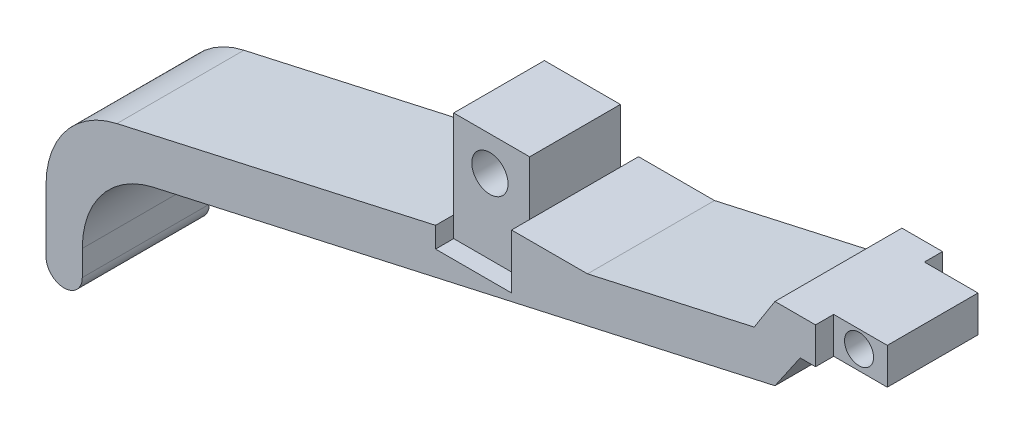
ISO-10303-21;
HEADER;
FILE_DESCRIPTION(('STEP AP214'),'2;1');
FILE_NAME('part.step','',(''),(''),'','','');
FILE_SCHEMA(('AUTOMOTIVE_DESIGN { 1 0 10303 214 1 1 1 1 }'));
ENDSEC;
DATA;
#1=APPLICATION_CONTEXT('core data for automotive mechanical design processes');
#2=APPLICATION_PROTOCOL_DEFINITION('international standard','automotive_design',2000,#1);
#3=PRODUCT_CONTEXT('',#1,'mechanical');
#4=PRODUCT('Part','Part','',(#3));
#5=PRODUCT_RELATED_PRODUCT_CATEGORY('part','',(#4));
#6=PRODUCT_DEFINITION_FORMATION('','',#4);
#7=PRODUCT_DEFINITION_CONTEXT('part definition',#1,'design');
#8=PRODUCT_DEFINITION('design','',#6,#7);
#9=PRODUCT_DEFINITION_SHAPE('','',#8);
#10=(LENGTH_UNIT() NAMED_UNIT(*) SI_UNIT(.MILLI.,.METRE.));
#11=(NAMED_UNIT(*) PLANE_ANGLE_UNIT() SI_UNIT($,.RADIAN.));
#12=(NAMED_UNIT(*) SI_UNIT($,.STERADIAN.) SOLID_ANGLE_UNIT());
#13=UNCERTAINTY_MEASURE_WITH_UNIT(LENGTH_MEASURE(1.E-05),#10,'distance_accuracy_value','');
#14=(GEOMETRIC_REPRESENTATION_CONTEXT(3) GLOBAL_UNCERTAINTY_ASSIGNED_CONTEXT((#13)) GLOBAL_UNIT_ASSIGNED_CONTEXT((#10,
#11,#12)) REPRESENTATION_CONTEXT('',''));
#15=CARTESIAN_POINT('',(0.,0.,0.));
#16=DIRECTION('',(0.,0.,1.));
#17=DIRECTION('',(1.,0.,0.));
#18=AXIS2_PLACEMENT_3D('',#15,#16,#17);
#19=CARTESIAN_POINT('',(-31.9744682141532,4.39963354942464,7.));
#20=DIRECTION('',(0.218023084150926,-0.975943612498857,0.));
#21=DIRECTION('',(0.975943612498857,0.218023084150926,0.));
#22=AXIS2_PLACEMENT_3D('',#19,#20,#21);
#23=PLANE('',#22);
#24=DIRECTION('',(-0.975943612498857,-0.218023084150926,0.));
#25=VECTOR('',#24,1.);
#26=CARTESIAN_POINT('',(-31.9744682141532,4.39963354942464,7.));
#27=LINE('',#26,#25);
#28=CARTESIAN_POINT('',(-14.4105382537988,8.32336657121519,7.));
#29=VERTEX_POINT('',#28);
#30=CARTESIAN_POINT('',(-31.9744682141532,4.39963354942464,7.));
#31=VERTEX_POINT('',#30);
#32=EDGE_CURVE('E356',#29,#31,#27,.T.);
#33=ORIENTED_EDGE('',*,*,#32,.F.);
#34=DIRECTION('',(0.,0.,-1.));
#35=VECTOR('',#34,1.);
#36=CARTESIAN_POINT('',(-14.4105382537988,8.32336657121519,7.));
#37=LINE('',#36,#35);
#38=CARTESIAN_POINT('',(-14.4105382537988,8.32336657121519,6.));
#39=VERTEX_POINT('',#38);
#40=EDGE_CURVE('E277',#29,#39,#37,.T.);
#41=ORIENTED_EDGE('',*,*,#40,.T.);
#42=DIRECTION('',(0.,0.,1.));
#43=VECTOR('',#42,1.);
#44=CARTESIAN_POINT('',(-14.4105382537988,8.32336657121519,0.));
#45=LINE('',#44,#43);
#46=CARTESIAN_POINT('',(-14.4105382537988,8.32336657121519,1.));
#47=VERTEX_POINT('',#46);
#48=EDGE_CURVE('E324',#47,#39,#45,.T.);
#49=ORIENTED_EDGE('',*,*,#48,.F.);
#50=CARTESIAN_POINT('',(-14.4105382537988,8.32336657121519,0.));
#51=VERTEX_POINT('',#50);
#52=EDGE_CURVE('E321',#51,#47,#45,.T.);
#53=ORIENTED_EDGE('',*,*,#52,.F.);
#54=DIRECTION('',(-0.975943612498857,-0.218023084150926,0.));
#55=VECTOR('',#54,1.);
#56=CARTESIAN_POINT('',(-31.9744682141532,4.39963354942464,0.));
#57=LINE('',#56,#55);
#58=CARTESIAN_POINT('',(-31.9744682141532,4.39963354942464,0.));
#59=VERTEX_POINT('',#58);
#60=EDGE_CURVE('E381',#51,#59,#57,.T.);
#61=ORIENTED_EDGE('',*,*,#60,.T.);
#62=DIRECTION('',(0.,0.,-1.));
#63=VECTOR('',#62,1.);
#64=CARTESIAN_POINT('',(-31.9744682141532,4.39963354942464,7.));
#65=LINE('',#64,#63);
#66=EDGE_CURVE('E392',#31,#59,#65,.T.);
#67=ORIENTED_EDGE('',*,*,#66,.F.);
#68=EDGE_LOOP('',(#33,#41,#49,#53,#61,#67));
#69=FACE_BOUND('',#68,.T.);
#70=ADVANCED_FACE('F37',(#69),#23,.F.);
#71=CARTESIAN_POINT('',(-34.8843527933986,-3.90947195366568,7.));
#72=DIRECTION('',(0.,0.,-1.));
#73=DIRECTION('',(-1.,0.,0.));
#74=AXIS2_PLACEMENT_3D('',#71,#72,#73);
#75=CYLINDRICAL_SURFACE('',#74,0.999999999999997);
#76=CARTESIAN_POINT('',(-34.8843527933986,-3.90947195366568,0.));
#77=DIRECTION('',(0.,0.,1.));
#78=DIRECTION('',(-1.,0.,0.));
#79=AXIS2_PLACEMENT_3D('',#76,#77,#78);
#80=CIRCLE('',#79,0.999999999999997);
#81=CARTESIAN_POINT('',(-35.8843527933986,-3.90947195366568,0.));
#82=VERTEX_POINT('',#81);
#83=CARTESIAN_POINT('',(-33.8843527933986,-3.90947195366568,0.));
#84=VERTEX_POINT('',#83);
#85=EDGE_CURVE('E323',#82,#84,#80,.T.);
#86=ORIENTED_EDGE('',*,*,#85,.T.);
#87=DIRECTION('',(0.,0.,-1.));
#88=VECTOR('',#87,1.);
#89=CARTESIAN_POINT('',(-33.8843527933986,-3.90947195366568,7.));
#90=LINE('',#89,#88);
#91=CARTESIAN_POINT('',(-33.8843527933986,-3.90947195366568,7.));
#92=VERTEX_POINT('',#91);
#93=EDGE_CURVE('E12',#92,#84,#90,.T.);
#94=ORIENTED_EDGE('',*,*,#93,.F.);
#95=CARTESIAN_POINT('',(-34.8843527933986,-3.90947195366568,7.));
#96=DIRECTION('',(0.,0.,1.));
#97=DIRECTION('',(-1.,0.,0.));
#98=AXIS2_PLACEMENT_3D('',#95,#96,#97);
#99=CIRCLE('',#98,0.999999999999997);
#100=CARTESIAN_POINT('',(-35.8843527933986,-3.90947195366568,7.));
#101=VERTEX_POINT('',#100);
#102=EDGE_CURVE('E337',#101,#92,#99,.T.);
#103=ORIENTED_EDGE('',*,*,#102,.F.);
#104=DIRECTION('',(0.,0.,-1.));
#105=VECTOR('',#104,1.);
#106=CARTESIAN_POINT('',(-35.8843527933986,-3.90947195366568,7.));
#107=LINE('',#106,#105);
#108=EDGE_CURVE('E363',#101,#82,#107,.T.);
#109=ORIENTED_EDGE('',*,*,#108,.T.);
#110=EDGE_LOOP('',(#86,#94,#103,#109));
#111=FACE_BOUND('',#110,.T.);
#112=ADVANCED_FACE('F39',(#111),#75,.T.);
#113=CARTESIAN_POINT('',(-33.8843527933986,-2.51823698971936,7.));
#114=DIRECTION('',(-1.,0.,0.));
#115=DIRECTION('',(0.,-1.,0.));
#116=AXIS2_PLACEMENT_3D('',#113,#114,#115);
#117=PLANE('',#116);
#118=DIRECTION('',(0.,1.,0.));
#119=VECTOR('',#118,1.);
#120=CARTESIAN_POINT('',(-33.8843527933986,-2.51823698971936,0.));
#121=LINE('',#120,#119);
#122=CARTESIAN_POINT('',(-33.8843527933986,-2.51823698971936,0.));
#123=VERTEX_POINT('',#122);
#124=EDGE_CURVE('E366',#84,#123,#121,.T.);
#125=ORIENTED_EDGE('',*,*,#124,.T.);
#126=DIRECTION('',(0.,0.,-1.));
#127=VECTOR('',#126,1.);
#128=CARTESIAN_POINT('',(-33.8843527933986,-2.51823698971936,7.));
#129=LINE('',#128,#127);
#130=CARTESIAN_POINT('',(-33.8843527933986,-2.51823698971936,7.));
#131=VERTEX_POINT('',#130);
#132=EDGE_CURVE('E46',#131,#123,#129,.T.);
#133=ORIENTED_EDGE('',*,*,#132,.F.);
#134=DIRECTION('',(0.,1.,0.));
#135=VECTOR('',#134,1.);
#136=CARTESIAN_POINT('',(-33.8843527933986,-2.51823698971936,7.));
#137=LINE('',#136,#135);
#138=EDGE_CURVE('E340',#92,#131,#137,.T.);
#139=ORIENTED_EDGE('',*,*,#138,.F.);
#140=ORIENTED_EDGE('',*,*,#93,.T.);
#141=EDGE_LOOP('',(#125,#133,#139,#140));
#142=FACE_BOUND('',#141,.T.);
#143=ADVANCED_FACE('F490',(#142),#117,.F.);
#144=CARTESIAN_POINT('',(-28.8843527933986,-2.51823698971936,7.));
#145=DIRECTION('',(0.,0.,-1.));
#146=DIRECTION('',(-1.,0.,0.));
#147=AXIS2_PLACEMENT_3D('',#144,#145,#146);
#148=CYLINDRICAL_SURFACE('',#147,5.);
#149=CARTESIAN_POINT('',(-28.8843527933986,-2.51823698971936,0.));
#150=DIRECTION('',(0.,0.,-1.));
#151=DIRECTION('',(1.,0.,0.));
#152=AXIS2_PLACEMENT_3D('',#149,#150,#151);
#153=CIRCLE('',#152,5.);
#154=CARTESIAN_POINT('',(-29.9744682141532,2.36148107277493,0.));
#155=VERTEX_POINT('',#154);
#156=EDGE_CURVE('E368',#123,#155,#153,.T.);
#157=ORIENTED_EDGE('',*,*,#156,.T.);
#158=DIRECTION('',(0.,0.,-1.));
#159=VECTOR('',#158,1.);
#160=CARTESIAN_POINT('',(-29.9744682141532,2.36148107277493,7.));
#161=LINE('',#160,#159);
#162=CARTESIAN_POINT('',(-29.9744682141532,2.36148107277493,7.));
#163=VERTEX_POINT('',#162);
#164=EDGE_CURVE('E413',#163,#155,#161,.T.);
#165=ORIENTED_EDGE('',*,*,#164,.F.);
#166=CARTESIAN_POINT('',(-28.8843527933986,-2.51823698971936,7.));
#167=DIRECTION('',(0.,0.,-1.));
#168=DIRECTION('',(1.,0.,0.));
#169=AXIS2_PLACEMENT_3D('',#166,#167,#168);
#170=CIRCLE('',#169,5.);
#171=EDGE_CURVE('E343',#131,#163,#170,.T.);
#172=ORIENTED_EDGE('',*,*,#171,.F.);
#173=ORIENTED_EDGE('',*,*,#132,.T.);
#174=EDGE_LOOP('',(#157,#165,#172,#173));
#175=FACE_BOUND('',#174,.T.);
#176=ADVANCED_FACE('F493',(#175),#148,.F.);
#177=CARTESIAN_POINT('',(4.29646039935999,10.0175110496534,7.));
#178=DIRECTION('',(-0.218023084150926,0.975943612498857,0.));
#179=DIRECTION('',(-0.975943612498857,-0.218023084150926,0.));
#180=AXIS2_PLACEMENT_3D('',#177,#178,#179);
#181=PLANE('',#180);
#182=DIRECTION('',(0.975943612498857,0.218023084150926,0.));
#183=VECTOR('',#182,1.);
#184=CARTESIAN_POINT('',(4.29646039935999,10.0175110496534,0.));
#185=LINE('',#184,#183);
#186=CARTESIAN_POINT('',(4.29646039935999,10.0175110496534,0.));
#187=VERTEX_POINT('',#186);
#188=EDGE_CURVE('E370',#155,#187,#185,.T.);
#189=ORIENTED_EDGE('',*,*,#188,.T.);
#190=DIRECTION('',(0.,0.,-1.));
#191=VECTOR('',#190,1.);
#192=CARTESIAN_POINT('',(4.29646039935999,10.0175110496534,7.));
#193=LINE('',#192,#191);
#194=CARTESIAN_POINT('',(4.29646039935999,10.0175110496534,7.));
#195=VERTEX_POINT('',#194);
#196=EDGE_CURVE('E410',#195,#187,#193,.T.);
#197=ORIENTED_EDGE('',*,*,#196,.F.);
#198=DIRECTION('',(0.975943612498857,0.218023084150926,0.));
#199=VECTOR('',#198,1.);
#200=CARTESIAN_POINT('',(4.29646039935999,10.0175110496534,7.));
#201=LINE('',#200,#199);
#202=EDGE_CURVE('E345',#163,#195,#201,.T.);
#203=ORIENTED_EDGE('',*,*,#202,.F.);
#204=ORIENTED_EDGE('',*,*,#164,.T.);
#205=EDGE_LOOP('',(#189,#197,#203,#204));
#206=FACE_BOUND('',#205,.T.);
#207=ADVANCED_FACE('F498',(#206),#181,.F.);
#208=CARTESIAN_POINT('',(4.29646039935999,10.0175110496534,7.));
#209=DIRECTION('',(-0.824410867479304,0.565991803458337,0.));
#210=DIRECTION('',(-0.565991803458337,-0.824410867479304,0.));
#211=AXIS2_PLACEMENT_3D('',#208,#209,#210);
#212=PLANE('',#211);
#213=DIRECTION('',(0.565991803458337,0.824410867479304,0.));
#214=VECTOR('',#213,1.);
#215=CARTESIAN_POINT('',(4.29646039935999,10.0175110496534,0.));
#216=LINE('',#215,#214);
#217=CARTESIAN_POINT('',(5.68728202772147,12.043350395984,0.));
#218=VERTEX_POINT('',#217);
#219=EDGE_CURVE('E372',#187,#218,#216,.T.);
#220=ORIENTED_EDGE('',*,*,#219,.T.);
#221=DIRECTION('',(0.,0.,-1.));
#222=VECTOR('',#221,1.);
#223=CARTESIAN_POINT('',(5.68728202772147,12.043350395984,7.));
#224=LINE('',#223,#222);
#225=CARTESIAN_POINT('',(5.68728202772147,12.043350395984,7.));
#226=VERTEX_POINT('',#225);
#227=EDGE_CURVE('E407',#226,#218,#224,.T.);
#228=ORIENTED_EDGE('',*,*,#227,.F.);
#229=DIRECTION('',(0.565991803458337,0.824410867479304,0.));
#230=VECTOR('',#229,1.);
#231=CARTESIAN_POINT('',(4.29646039935999,10.0175110496534,7.));
#232=LINE('',#231,#230);
#233=EDGE_CURVE('E347',#195,#226,#232,.T.);
#234=ORIENTED_EDGE('',*,*,#233,.F.);
#235=ORIENTED_EDGE('',*,*,#196,.T.);
#236=EDGE_LOOP('',(#220,#228,#234,#235));
#237=FACE_BOUND('',#236,.T.);
#238=ADVANCED_FACE('F503',(#237),#212,.F.);
#239=CARTESIAN_POINT('',(9.48938033351357,12.043350395984,7.));
#240=DIRECTION('',(0.,1.,0.));
#241=DIRECTION('',(0.,0.,1.));
#242=AXIS2_PLACEMENT_3D('',#239,#240,#241);
#243=PLANE('',#242);
#244=DIRECTION('',(0.,0.,-1.));
#245=VECTOR('',#244,1.);
#246=CARTESIAN_POINT('',(9.48938033351357,12.043350395984,7.));
#247=LINE('',#246,#245);
#248=CARTESIAN_POINT('',(9.48938033351357,12.043350395984,6.));
#249=VERTEX_POINT('',#248);
#250=CARTESIAN_POINT('',(9.48938033351357,12.043350395984,1.));
#251=VERTEX_POINT('',#250);
#252=EDGE_CURVE('E404',#249,#251,#247,.T.);
#253=ORIENTED_EDGE('',*,*,#252,.F.);
#254=DIRECTION('',(1.,0.,0.));
#255=VECTOR('',#254,1.);
#256=CARTESIAN_POINT('',(6.53439533204678,12.043350395984,6.));
#257=LINE('',#256,#255);
#258=CARTESIAN_POINT('',(6.53439533204678,12.043350395984,6.));
#259=VERTEX_POINT('',#258);
#260=EDGE_CURVE('E284',#259,#249,#257,.T.);
#261=ORIENTED_EDGE('',*,*,#260,.F.);
#262=DIRECTION('',(0.,0.,-1.));
#263=VECTOR('',#262,1.);
#264=CARTESIAN_POINT('',(6.53439533204678,12.043350395984,7.));
#265=LINE('',#264,#263);
#266=CARTESIAN_POINT('',(6.53439533204678,12.043350395984,7.));
#267=VERTEX_POINT('',#266);
#268=EDGE_CURVE('E281',#267,#259,#265,.T.);
#269=ORIENTED_EDGE('',*,*,#268,.F.);
#270=DIRECTION('',(1.,0.,0.));
#271=VECTOR('',#270,1.);
#272=CARTESIAN_POINT('',(9.48938033351357,12.043350395984,7.));
#273=LINE('',#272,#271);
#274=EDGE_CURVE('E349',#226,#267,#273,.T.);
#275=ORIENTED_EDGE('',*,*,#274,.F.);
#276=ORIENTED_EDGE('',*,*,#227,.T.);
#277=DIRECTION('',(1.,0.,0.));
#278=VECTOR('',#277,1.);
#279=CARTESIAN_POINT('',(9.48938033351357,12.043350395984,0.));
#280=LINE('',#279,#278);
#281=CARTESIAN_POINT('',(6.53439533204678,12.043350395984,0.));
#282=VERTEX_POINT('',#281);
#283=EDGE_CURVE('E374',#218,#282,#280,.T.);
#284=ORIENTED_EDGE('',*,*,#283,.T.);
#285=DIRECTION('',(0.,0.,-1.));
#286=VECTOR('',#285,1.);
#287=CARTESIAN_POINT('',(6.53439533204678,12.043350395984,0.));
#288=LINE('',#287,#286);
#289=CARTESIAN_POINT('',(6.53439533204678,12.043350395984,1.));
#290=VERTEX_POINT('',#289);
#291=EDGE_CURVE('E297',#290,#282,#288,.T.);
#292=ORIENTED_EDGE('',*,*,#291,.F.);
#293=DIRECTION('',(-1.,0.,0.));
#294=VECTOR('',#293,1.);
#295=CARTESIAN_POINT('',(6.53439533204678,12.043350395984,1.));
#296=LINE('',#295,#294);
#297=EDGE_CURVE('E285',#251,#290,#296,.T.);
#298=ORIENTED_EDGE('',*,*,#297,.F.);
#299=EDGE_LOOP('',(#253,#261,#269,#275,#276,#284,#292,#298));
#300=FACE_BOUND('',#299,.T.);
#301=ADVANCED_FACE('F509',(#300),#243,.F.);
#302=CARTESIAN_POINT('',(9.48938033351357,14.043350395984,7.));
#303=DIRECTION('',(-1.,0.,0.));
#304=DIRECTION('',(0.,0.,1.));
#305=AXIS2_PLACEMENT_3D('',#302,#303,#304);
#306=PLANE('',#305);
#307=DIRECTION('',(0.,0.,-1.));
#308=VECTOR('',#307,1.);
#309=CARTESIAN_POINT('',(9.48938033351357,14.043350395984,7.));
#310=LINE('',#309,#308);
#311=CARTESIAN_POINT('',(9.48938033351357,14.043350395984,6.));
#312=VERTEX_POINT('',#311);
#313=CARTESIAN_POINT('',(9.48938033351357,14.043350395984,1.));
#314=VERTEX_POINT('',#313);
#315=EDGE_CURVE('E401',#312,#314,#310,.T.);
#316=ORIENTED_EDGE('',*,*,#315,.F.);
#317=DIRECTION('',(0.,-1.,0.));
#318=VECTOR('',#317,1.);
#319=CARTESIAN_POINT('',(9.48938033351357,22.0433503959839,6.));
#320=LINE('',#319,#318);
#321=EDGE_CURVE('E288',#312,#249,#320,.T.);
#322=ORIENTED_EDGE('',*,*,#321,.T.);
#323=ORIENTED_EDGE('',*,*,#252,.T.);
#324=DIRECTION('',(0.,-1.,0.));
#325=VECTOR('',#324,1.);
#326=CARTESIAN_POINT('',(9.48938033351357,22.0433503959839,1.));
#327=LINE('',#326,#325);
#328=EDGE_CURVE('E295',#314,#251,#327,.T.);
#329=ORIENTED_EDGE('',*,*,#328,.F.);
#330=EDGE_LOOP('',(#316,#322,#323,#329));
#331=FACE_BOUND('',#330,.T.);
#332=ADVANCED_FACE('F567',(#331),#306,.F.);
#333=CARTESIAN_POINT('',(4.29646039936,14.043350395984,7.));
#334=DIRECTION('',(0.,-1.,0.));
#335=DIRECTION('',(1.,0.,0.));
#336=AXIS2_PLACEMENT_3D('',#333,#334,#335);
#337=PLANE('',#336);
#338=DIRECTION('',(0.,0.,-1.));
#339=VECTOR('',#338,1.);
#340=CARTESIAN_POINT('',(6.53439533204678,14.043350395984,7.));
#341=LINE('',#340,#339);
#342=CARTESIAN_POINT('',(6.53439533204678,14.043350395984,7.));
#343=VERTEX_POINT('',#342);
#344=CARTESIAN_POINT('',(6.53439533204678,14.043350395984,6.));
#345=VERTEX_POINT('',#344);
#346=EDGE_CURVE('E62',#343,#345,#341,.T.);
#347=ORIENTED_EDGE('',*,*,#346,.T.);
#348=DIRECTION('',(1.,0.,0.));
#349=VECTOR('',#348,1.);
#350=CARTESIAN_POINT('',(4.29646039936,14.043350395984,6.));
#351=LINE('',#350,#349);
#352=EDGE_CURVE('E309',#345,#312,#351,.T.);
#353=ORIENTED_EDGE('',*,*,#352,.T.);
#354=ORIENTED_EDGE('',*,*,#315,.T.);
#355=DIRECTION('',(-1.,0.,0.));
#356=VECTOR('',#355,1.);
#357=CARTESIAN_POINT('',(4.29646039936,14.043350395984,1.));
#358=LINE('',#357,#356);
#359=CARTESIAN_POINT('',(6.53439533204678,14.043350395984,1.));
#360=VERTEX_POINT('',#359);
#361=EDGE_CURVE('E305',#314,#360,#358,.T.);
#362=ORIENTED_EDGE('',*,*,#361,.T.);
#363=DIRECTION('',(0.,0.,-1.));
#364=VECTOR('',#363,1.);
#365=CARTESIAN_POINT('',(6.53439533204678,14.043350395984,7.));
#366=LINE('',#365,#364);
#367=CARTESIAN_POINT('',(6.53439533204678,14.043350395984,0.));
#368=VERTEX_POINT('',#367);
#369=EDGE_CURVE('E312',#360,#368,#366,.T.);
#370=ORIENTED_EDGE('',*,*,#369,.T.);
#371=DIRECTION('',(-1.,0.,0.));
#372=VECTOR('',#371,1.);
#373=CARTESIAN_POINT('',(4.29646039936,14.043350395984,0.));
#374=LINE('',#373,#372);
#375=CARTESIAN_POINT('',(4.29646039936,14.043350395984,0.));
#376=VERTEX_POINT('',#375);
#377=EDGE_CURVE('E377',#368,#376,#374,.T.);
#378=ORIENTED_EDGE('',*,*,#377,.T.);
#379=DIRECTION('',(0.,0.,-1.));
#380=VECTOR('',#379,1.);
#381=CARTESIAN_POINT('',(4.29646039936,14.043350395984,7.));
#382=LINE('',#381,#380);
#383=CARTESIAN_POINT('',(4.29646039936,14.043350395984,7.));
#384=VERTEX_POINT('',#383);
#385=EDGE_CURVE('E398',#384,#376,#382,.T.);
#386=ORIENTED_EDGE('',*,*,#385,.F.);
#387=DIRECTION('',(-1.,0.,0.));
#388=VECTOR('',#387,1.);
#389=CARTESIAN_POINT('',(4.29646039936,14.043350395984,7.));
#390=LINE('',#389,#388);
#391=EDGE_CURVE('E352',#343,#384,#390,.T.);
#392=ORIENTED_EDGE('',*,*,#391,.F.);
#393=EDGE_LOOP('',(#347,#353,#354,#362,#370,#378,#386,#392));
#394=FACE_BOUND('',#393,.T.);
#395=ADVANCED_FACE('F515',(#394),#337,.F.);
#396=CARTESIAN_POINT('',(3.15339170655568,12.2470995930057,7.));
#397=DIRECTION('',(0.843661487732109,-0.536875492193157,0.));
#398=DIRECTION('',(0.536875492193158,0.843661487732109,0.));
#399=AXIS2_PLACEMENT_3D('',#396,#397,#398);
#400=PLANE('',#399);
#401=DIRECTION('',(-0.536875492193157,-0.843661487732109,0.));
#402=VECTOR('',#401,1.);
#403=CARTESIAN_POINT('',(3.15339170655568,12.2470995930057,0.));
#404=LINE('',#403,#402);
#405=CARTESIAN_POINT('',(3.15339170655568,12.2470995930057,0.));
#406=VERTEX_POINT('',#405);
#407=EDGE_CURVE('E379',#376,#406,#404,.T.);
#408=ORIENTED_EDGE('',*,*,#407,.T.);
#409=DIRECTION('',(0.,0.,-1.));
#410=VECTOR('',#409,1.);
#411=CARTESIAN_POINT('',(3.15339170655568,12.2470995930057,7.));
#412=LINE('',#411,#410);
#413=CARTESIAN_POINT('',(3.15339170655568,12.2470995930057,7.));
#414=VERTEX_POINT('',#413);
#415=EDGE_CURVE('E395',#414,#406,#412,.T.);
#416=ORIENTED_EDGE('',*,*,#415,.F.);
#417=DIRECTION('',(-0.536875492193157,-0.843661487732109,0.));
#418=VECTOR('',#417,1.);
#419=CARTESIAN_POINT('',(3.15339170655568,12.2470995930057,7.));
#420=LINE('',#419,#418);
#421=EDGE_CURVE('E354',#384,#414,#420,.T.);
#422=ORIENTED_EDGE('',*,*,#421,.F.);
#423=ORIENTED_EDGE('',*,*,#385,.T.);
#424=EDGE_LOOP('',(#408,#416,#422,#423));
#425=FACE_BOUND('',#424,.T.);
#426=ADVANCED_FACE('F521',(#425),#400,.F.);
#427=CARTESIAN_POINT('',(-6.034764609183,10.1944910693545,0.));
#428=VERTEX_POINT('',#427);
#429=EDGE_CURVE('E382',#406,#428,#57,.T.);
#430=ORIENTED_EDGE('',*,*,#429,.T.);
#431=DIRECTION('',(0.,0.,1.));
#432=VECTOR('',#431,1.);
#433=CARTESIAN_POINT('',(-6.034764609183,10.1944910693545,0.));
#434=LINE('',#433,#432);
#435=CARTESIAN_POINT('',(-6.034764609183,10.1944910693545,7.));
#436=VERTEX_POINT('',#435);
#437=EDGE_CURVE('E319',#428,#436,#434,.T.);
#438=ORIENTED_EDGE('',*,*,#437,.T.);
#439=EDGE_CURVE('E357',#414,#436,#27,.T.);
#440=ORIENTED_EDGE('',*,*,#439,.F.);
#441=ORIENTED_EDGE('',*,*,#415,.T.);
#442=EDGE_LOOP('',(#430,#438,#440,#441));
#443=FACE_BOUND('',#442,.T.);
#444=ADVANCED_FACE('F545',(#443),#23,.F.);
#445=CARTESIAN_POINT('',(-30.8843527933986,-0.480084513069647,7.));
#446=DIRECTION('',(0.,0.,-1.));
#447=DIRECTION('',(-1.,0.,0.));
#448=AXIS2_PLACEMENT_3D('',#445,#446,#447);
#449=CYLINDRICAL_SURFACE('',#448,5.);
#450=CARTESIAN_POINT('',(-30.8843527933986,-0.480084513069647,0.));
#451=DIRECTION('',(0.,0.,1.));
#452=DIRECTION('',(-1.,0.,0.));
#453=AXIS2_PLACEMENT_3D('',#450,#451,#452);
#454=CIRCLE('',#453,5.);
#455=CARTESIAN_POINT('',(-35.8843527933986,-0.480084513069669,0.));
#456=VERTEX_POINT('',#455);
#457=EDGE_CURVE('E384',#59,#456,#454,.T.);
#458=ORIENTED_EDGE('',*,*,#457,.T.);
#459=DIRECTION('',(0.,0.,-1.));
#460=VECTOR('',#459,1.);
#461=CARTESIAN_POINT('',(-35.8843527933986,-0.480084513069669,7.));
#462=LINE('',#461,#460);
#463=CARTESIAN_POINT('',(-35.8843527933986,-0.480084513069669,7.));
#464=VERTEX_POINT('',#463);
#465=EDGE_CURVE('E389',#464,#456,#462,.T.);
#466=ORIENTED_EDGE('',*,*,#465,.F.);
#467=CARTESIAN_POINT('',(-30.8843527933986,-0.480084513069647,7.));
#468=DIRECTION('',(0.,0.,1.));
#469=DIRECTION('',(-1.,0.,0.));
#470=AXIS2_PLACEMENT_3D('',#467,#468,#469);
#471=CIRCLE('',#470,5.);
#472=EDGE_CURVE('E359',#31,#464,#471,.T.);
#473=ORIENTED_EDGE('',*,*,#472,.F.);
#474=ORIENTED_EDGE('',*,*,#66,.T.);
#475=EDGE_LOOP('',(#458,#466,#473,#474));
#476=FACE_BOUND('',#475,.T.);
#477=ADVANCED_FACE('F474',(#476),#449,.T.);
#478=CARTESIAN_POINT('',(-35.8843527933986,-3.90947195366568,7.));
#479=DIRECTION('',(1.,0.,0.));
#480=DIRECTION('',(0.,1.,0.));
#481=AXIS2_PLACEMENT_3D('',#478,#479,#480);
#482=PLANE('',#481);
#483=DIRECTION('',(0.,-1.,0.));
#484=VECTOR('',#483,1.);
#485=CARTESIAN_POINT('',(-35.8843527933986,-3.90947195366568,0.));
#486=LINE('',#485,#484);
#487=EDGE_CURVE('E341',#456,#82,#486,.T.);
#488=ORIENTED_EDGE('',*,*,#487,.T.);
#489=ORIENTED_EDGE('',*,*,#108,.F.);
#490=DIRECTION('',(0.,-1.,0.));
#491=VECTOR('',#490,1.);
#492=CARTESIAN_POINT('',(-35.8843527933986,-3.90947195366568,7.));
#493=LINE('',#492,#491);
#494=EDGE_CURVE('E361',#464,#101,#493,.T.);
#495=ORIENTED_EDGE('',*,*,#494,.F.);
#496=ORIENTED_EDGE('',*,*,#465,.T.);
#497=EDGE_LOOP('',(#488,#489,#495,#496));
#498=FACE_BOUND('',#497,.T.);
#499=ADVANCED_FACE('F481',(#498),#482,.F.);
#500=CARTESIAN_POINT('',(-34.8843527933986,-3.90947195366568,7.));
#501=DIRECTION('',(0.,0.,-1.));
#502=DIRECTION('',(-1.,0.,0.));
#503=AXIS2_PLACEMENT_3D('',#500,#501,#502);
#504=PLANE('',#503);
#505=DIRECTION('',(1.,0.,0.));
#506=VECTOR('',#505,1.);
#507=CARTESIAN_POINT('',(-10.2226514314909,7.18832129988442,7.));
#508=LINE('',#507,#506);
#509=CARTESIAN_POINT('',(-14.4105382537988,7.18832129988442,7.));
#510=VERTEX_POINT('',#509);
#511=CARTESIAN_POINT('',(-10.2226514314909,7.18832129988442,7.));
#512=VERTEX_POINT('',#511);
#513=EDGE_CURVE('E230',#510,#512,#508,.T.);
#514=ORIENTED_EDGE('',*,*,#513,.F.);
#515=DIRECTION('',(0.,1.,0.));
#516=VECTOR('',#515,1.);
#517=CARTESIAN_POINT('',(-14.4105382537988,7.18832129988442,7.));
#518=LINE('',#517,#516);
#519=EDGE_CURVE('E423',#510,#29,#518,.T.);
#520=ORIENTED_EDGE('',*,*,#519,.T.);
#521=ORIENTED_EDGE('',*,*,#32,.T.);
#522=ORIENTED_EDGE('',*,*,#472,.T.);
#523=ORIENTED_EDGE('',*,*,#494,.T.);
#524=ORIENTED_EDGE('',*,*,#102,.T.);
#525=ORIENTED_EDGE('',*,*,#138,.T.);
#526=ORIENTED_EDGE('',*,*,#171,.T.);
#527=ORIENTED_EDGE('',*,*,#202,.T.);
#528=ORIENTED_EDGE('',*,*,#233,.T.);
#529=ORIENTED_EDGE('',*,*,#274,.T.);
#530=DIRECTION('',(0.,-1.,0.));
#531=VECTOR('',#530,1.);
#532=CARTESIAN_POINT('',(6.53439533204678,22.0433503959839,7.));
#533=LINE('',#532,#531);
#534=EDGE_CURVE('E287',#343,#267,#533,.T.);
#535=ORIENTED_EDGE('',*,*,#534,.F.);
#536=ORIENTED_EDGE('',*,*,#391,.T.);
#537=ORIENTED_EDGE('',*,*,#421,.T.);
#538=ORIENTED_EDGE('',*,*,#439,.T.);
#539=DIRECTION('',(-1.,0.,0.));
#540=VECTOR('',#539,1.);
#541=CARTESIAN_POINT('',(-6.034764609183,10.1944910693545,7.));
#542=LINE('',#541,#540);
#543=CARTESIAN_POINT('',(-10.2226514314909,10.1944910693545,7.));
#544=VERTEX_POINT('',#543);
#545=EDGE_CURVE('E245',#436,#544,#542,.T.);
#546=ORIENTED_EDGE('',*,*,#545,.T.);
#547=DIRECTION('',(0.,1.,0.));
#548=VECTOR('',#547,1.);
#549=CARTESIAN_POINT('',(-10.2226514314909,7.18832129988442,7.));
#550=LINE('',#549,#548);
#551=EDGE_CURVE('E222',#512,#544,#550,.T.);
#552=ORIENTED_EDGE('',*,*,#551,.F.);
#553=EDGE_LOOP('',(#514,#520,#521,#522,#523,#524,#525,#526,#527,#528,#529,#535,#536,#537,#538,
#546,#552));
#554=FACE_BOUND('',#553,.T.);
#555=ADVANCED_FACE('F242',(#554),#504,.F.);
#556=CARTESIAN_POINT('',(-34.8843527933986,-3.90947195366568,0.));
#557=DIRECTION('',(0.,0.,-1.));
#558=DIRECTION('',(-1.,0.,0.));
#559=AXIS2_PLACEMENT_3D('',#556,#557,#558);
#560=PLANE('',#559);
#561=DIRECTION('',(0.,1.,0.));
#562=VECTOR('',#561,1.);
#563=CARTESIAN_POINT('',(-10.2226514314909,7.18832129988442,0.));
#564=LINE('',#563,#562);
#565=CARTESIAN_POINT('',(-10.2226514314909,7.18832129988442,0.));
#566=VERTEX_POINT('',#565);
#567=CARTESIAN_POINT('',(-10.2226514314909,10.1944910693545,0.));
#568=VERTEX_POINT('',#567);
#569=EDGE_CURVE('E252',#566,#568,#564,.T.);
#570=ORIENTED_EDGE('',*,*,#569,.T.);
#571=DIRECTION('',(-1.,0.,0.));
#572=VECTOR('',#571,1.);
#573=CARTESIAN_POINT('',(-6.034764609183,10.1944910693545,0.));
#574=LINE('',#573,#572);
#575=EDGE_CURVE('E316',#428,#568,#574,.T.);
#576=ORIENTED_EDGE('',*,*,#575,.F.);
#577=ORIENTED_EDGE('',*,*,#429,.F.);
#578=ORIENTED_EDGE('',*,*,#407,.F.);
#579=ORIENTED_EDGE('',*,*,#377,.F.);
#580=DIRECTION('',(0.,-1.,0.));
#581=VECTOR('',#580,1.);
#582=CARTESIAN_POINT('',(6.53439533204678,22.0433503959839,0.));
#583=LINE('',#582,#581);
#584=EDGE_CURVE('E280',#368,#282,#583,.T.);
#585=ORIENTED_EDGE('',*,*,#584,.T.);
#586=ORIENTED_EDGE('',*,*,#283,.F.);
#587=ORIENTED_EDGE('',*,*,#219,.F.);
#588=ORIENTED_EDGE('',*,*,#188,.F.);
#589=ORIENTED_EDGE('',*,*,#156,.F.);
#590=ORIENTED_EDGE('',*,*,#124,.F.);
#591=ORIENTED_EDGE('',*,*,#85,.F.);
#592=ORIENTED_EDGE('',*,*,#487,.F.);
#593=ORIENTED_EDGE('',*,*,#457,.F.);
#594=ORIENTED_EDGE('',*,*,#60,.F.);
#595=DIRECTION('',(0.,1.,0.));
#596=VECTOR('',#595,1.);
#597=CARTESIAN_POINT('',(-14.4105382537988,7.18832129988442,0.));
#598=LINE('',#597,#596);
#599=CARTESIAN_POINT('',(-14.4105382537988,7.18832129988442,0.));
#600=VERTEX_POINT('',#599);
#601=EDGE_CURVE('E256',#600,#51,#598,.T.);
#602=ORIENTED_EDGE('',*,*,#601,.F.);
#603=DIRECTION('',(-1.,0.,0.));
#604=VECTOR('',#603,1.);
#605=CARTESIAN_POINT('',(-10.2226514314909,7.18832129988442,0.));
#606=LINE('',#605,#604);
#607=EDGE_CURVE('E272',#566,#600,#606,.T.);
#608=ORIENTED_EDGE('',*,*,#607,.F.);
#609=EDGE_LOOP('',(#570,#576,#577,#578,#579,#585,#586,#587,#588,#589,#590,#591,#592,#593,#594,
#602,#608));
#610=FACE_BOUND('',#609,.T.);
#611=ADVANCED_FACE('F477',(#610),#560,.T.);
#612=CARTESIAN_POINT('',(-14.4105382537988,10.1944910693545,0.));
#613=DIRECTION('',(-1.,0.,0.));
#614=DIRECTION('',(0.,0.,1.));
#615=AXIS2_PLACEMENT_3D('',#612,#613,#614);
#616=PLANE('',#615);
#617=DIRECTION('',(0.,1.,0.));
#618=VECTOR('',#617,1.);
#619=CARTESIAN_POINT('',(-14.4105382537988,7.18832129988442,6.));
#620=LINE('',#619,#618);
#621=CARTESIAN_POINT('',(-14.4105382537988,13.1883212998844,6.));
#622=VERTEX_POINT('',#621);
#623=EDGE_CURVE('E431',#39,#622,#620,.T.);
#624=ORIENTED_EDGE('',*,*,#623,.T.);
#625=DIRECTION('',(0.,0.,1.));
#626=VECTOR('',#625,1.);
#627=CARTESIAN_POINT('',(-14.4105382537988,13.1883212998844,0.));
#628=LINE('',#627,#626);
#629=CARTESIAN_POINT('',(-14.4105382537988,13.1883212998844,1.));
#630=VERTEX_POINT('',#629);
#631=EDGE_CURVE('E325',#630,#622,#628,.T.);
#632=ORIENTED_EDGE('',*,*,#631,.F.);
#633=DIRECTION('',(0.,1.,0.));
#634=VECTOR('',#633,1.);
#635=CARTESIAN_POINT('',(-14.4105382537988,7.18832129988442,1.));
#636=LINE('',#635,#634);
#637=EDGE_CURVE('E261',#47,#630,#636,.T.);
#638=ORIENTED_EDGE('',*,*,#637,.F.);
#639=ORIENTED_EDGE('',*,*,#48,.T.);
#640=EDGE_LOOP('',(#624,#632,#638,#639));
#641=FACE_BOUND('',#640,.T.);
#642=ADVANCED_FACE('F445',(#641),#616,.T.);
#643=CARTESIAN_POINT('',(-10.2226514314909,13.1883212998844,0.));
#644=DIRECTION('',(0.,1.,0.));
#645=DIRECTION('',(0.,0.,1.));
#646=AXIS2_PLACEMENT_3D('',#643,#644,#645);
#647=PLANE('',#646);
#648=DIRECTION('',(-1.,0.,0.));
#649=VECTOR('',#648,1.);
#650=CARTESIAN_POINT('',(-14.4105382537988,13.1883212998844,6.));
#651=LINE('',#650,#649);
#652=CARTESIAN_POINT('',(-10.2226514314909,13.1883212998844,6.));
#653=VERTEX_POINT('',#652);
#654=EDGE_CURVE('E239',#653,#622,#651,.T.);
#655=ORIENTED_EDGE('',*,*,#654,.F.);
#656=DIRECTION('',(0.,0.,1.));
#657=VECTOR('',#656,1.);
#658=CARTESIAN_POINT('',(-10.2226514314909,13.1883212998844,0.));
#659=LINE('',#658,#657);
#660=CARTESIAN_POINT('',(-10.2226514314909,13.1883212998844,1.));
#661=VERTEX_POINT('',#660);
#662=EDGE_CURVE('E328',#661,#653,#659,.T.);
#663=ORIENTED_EDGE('',*,*,#662,.F.);
#664=DIRECTION('',(1.,0.,0.));
#665=VECTOR('',#664,1.);
#666=CARTESIAN_POINT('',(-14.4105382537988,13.1883212998844,1.));
#667=LINE('',#666,#665);
#668=EDGE_CURVE('E264',#630,#661,#667,.T.);
#669=ORIENTED_EDGE('',*,*,#668,.F.);
#670=ORIENTED_EDGE('',*,*,#631,.T.);
#671=EDGE_LOOP('',(#655,#663,#669,#670));
#672=FACE_BOUND('',#671,.T.);
#673=ADVANCED_FACE('F456',(#672),#647,.T.);
#674=CARTESIAN_POINT('',(-10.2226514314909,10.1944910693545,0.));
#675=DIRECTION('',(1.,0.,0.));
#676=DIRECTION('',(0.,0.,-1.));
#677=AXIS2_PLACEMENT_3D('',#674,#675,#676);
#678=PLANE('',#677);
#679=DIRECTION('',(0.,1.,0.));
#680=VECTOR('',#679,1.);
#681=CARTESIAN_POINT('',(-10.2226514314909,7.18832129988442,6.));
#682=LINE('',#681,#680);
#683=CARTESIAN_POINT('',(-10.2226514314909,10.1944910693545,6.));
#684=VERTEX_POINT('',#683);
#685=EDGE_CURVE('E246',#684,#653,#682,.T.);
#686=ORIENTED_EDGE('',*,*,#685,.F.);
#687=DIRECTION('',(0.,0.,1.));
#688=VECTOR('',#687,1.);
#689=CARTESIAN_POINT('',(-10.2226514314909,10.1944910693545,0.));
#690=LINE('',#689,#688);
#691=CARTESIAN_POINT('',(-10.2226514314909,10.1944910693545,1.));
#692=VERTEX_POINT('',#691);
#693=EDGE_CURVE('E334',#692,#684,#690,.T.);
#694=ORIENTED_EDGE('',*,*,#693,.F.);
#695=DIRECTION('',(0.,1.,0.));
#696=VECTOR('',#695,1.);
#697=CARTESIAN_POINT('',(-10.2226514314909,7.18832129988442,1.));
#698=LINE('',#697,#696);
#699=EDGE_CURVE('E263',#692,#661,#698,.T.);
#700=ORIENTED_EDGE('',*,*,#699,.T.);
#701=ORIENTED_EDGE('',*,*,#662,.T.);
#702=EDGE_LOOP('',(#686,#694,#700,#701));
#703=FACE_BOUND('',#702,.T.);
#704=ADVANCED_FACE('F459',(#703),#678,.T.);
#705=CARTESIAN_POINT('',(-6.034764609183,10.1944910693545,0.));
#706=DIRECTION('',(0.,1.,0.));
#707=DIRECTION('',(0.,0.,1.));
#708=AXIS2_PLACEMENT_3D('',#705,#706,#707);
#709=PLANE('',#708);
#710=ORIENTED_EDGE('',*,*,#545,.F.);
#711=ORIENTED_EDGE('',*,*,#437,.F.);
#712=ORIENTED_EDGE('',*,*,#575,.T.);
#713=EDGE_CURVE('E331',#568,#692,#690,.T.);
#714=ORIENTED_EDGE('',*,*,#713,.T.);
#715=ORIENTED_EDGE('',*,*,#693,.T.);
#716=EDGE_CURVE('E335',#684,#544,#690,.T.);
#717=ORIENTED_EDGE('',*,*,#716,.T.);
#718=EDGE_LOOP('',(#710,#711,#712,#714,#715,#717));
#719=FACE_BOUND('',#718,.T.);
#720=ADVANCED_FACE('F526',(#719),#709,.T.);
#721=CARTESIAN_POINT('',(6.53439533204678,22.0433503959839,0.));
#722=DIRECTION('',(-1.,0.,0.));
#723=DIRECTION('',(0.,0.,1.));
#724=AXIS2_PLACEMENT_3D('',#721,#722,#723);
#725=PLANE('',#724);
#726=DIRECTION('',(0.,-1.,0.));
#727=VECTOR('',#726,1.);
#728=CARTESIAN_POINT('',(6.53439533204678,22.0433503959839,1.));
#729=LINE('',#728,#727);
#730=EDGE_CURVE('E298',#360,#290,#729,.T.);
#731=ORIENTED_EDGE('',*,*,#730,.T.);
#732=ORIENTED_EDGE('',*,*,#291,.T.);
#733=ORIENTED_EDGE('',*,*,#584,.F.);
#734=ORIENTED_EDGE('',*,*,#369,.F.);
#735=EDGE_LOOP('',(#731,#732,#733,#734));
#736=FACE_BOUND('',#735,.T.);
#737=ADVANCED_FACE('F560',(#736),#725,.F.);
#738=CARTESIAN_POINT('',(6.53439533204678,22.0433503959839,1.));
#739=DIRECTION('',(0.,0.,1.));
#740=DIRECTION('',(1.,0.,0.));
#741=AXIS2_PLACEMENT_3D('',#738,#739,#740);
#742=PLANE('',#741);
#743=CARTESIAN_POINT('',(7.9323399733795,13.0902433946103,1.));
#744=DIRECTION('',(0.,0.,1.));
#745=DIRECTION('',(1.,0.,0.));
#746=AXIS2_PLACEMENT_3D('',#743,#744,#745);
#747=CIRCLE('',#746,0.800000000000001);
#748=CARTESIAN_POINT('',(8.7323399733795,13.0902433946103,1.));
#749=VERTEX_POINT('',#748);
#750=EDGE_CURVE('E291',#749,#749,#747,.F.);
#751=ORIENTED_EDGE('',*,*,#750,.F.);
#752=EDGE_LOOP('',(#751));
#753=FACE_BOUND('',#752,.T.);
#754=ORIENTED_EDGE('',*,*,#328,.T.);
#755=ORIENTED_EDGE('',*,*,#297,.T.);
#756=ORIENTED_EDGE('',*,*,#730,.F.);
#757=ORIENTED_EDGE('',*,*,#361,.F.);
#758=EDGE_LOOP('',(#754,#755,#756,#757));
#759=FACE_BOUND('',#758,.T.);
#760=ADVANCED_FACE('F563',(#753,#759),#742,.F.);
#761=CARTESIAN_POINT('',(6.53439533204678,22.0433503959839,7.));
#762=DIRECTION('',(-1.,0.,0.));
#763=DIRECTION('',(0.,0.,1.));
#764=AXIS2_PLACEMENT_3D('',#761,#762,#763);
#765=PLANE('',#764);
#766=ORIENTED_EDGE('',*,*,#534,.T.);
#767=ORIENTED_EDGE('',*,*,#268,.T.);
#768=DIRECTION('',(0.,-1.,0.));
#769=VECTOR('',#768,1.);
#770=CARTESIAN_POINT('',(6.53439533204678,22.0433503959839,6.));
#771=LINE('',#770,#769);
#772=EDGE_CURVE('E292',#345,#259,#771,.T.);
#773=ORIENTED_EDGE('',*,*,#772,.F.);
#774=ORIENTED_EDGE('',*,*,#346,.F.);
#775=EDGE_LOOP('',(#766,#767,#773,#774));
#776=FACE_BOUND('',#775,.T.);
#777=ADVANCED_FACE('F511',(#776),#765,.F.);
#778=CARTESIAN_POINT('',(6.53439533204678,22.0433503959839,6.));
#779=DIRECTION('',(0.,0.,-1.));
#780=DIRECTION('',(-1.,0.,0.));
#781=AXIS2_PLACEMENT_3D('',#778,#779,#780);
#782=PLANE('',#781);
#783=CARTESIAN_POINT('',(7.9323399733795,13.0902433946103,6.));
#784=DIRECTION('',(0.,0.,-1.));
#785=DIRECTION('',(-1.,0.,0.));
#786=AXIS2_PLACEMENT_3D('',#783,#784,#785);
#787=CIRCLE('',#786,0.800000000000001);
#788=CARTESIAN_POINT('',(7.1323399733795,13.0902433946103,6.));
#789=VERTEX_POINT('',#788);
#790=EDGE_CURVE('E308',#789,#789,#787,.F.);
#791=ORIENTED_EDGE('',*,*,#790,.F.);
#792=EDGE_LOOP('',(#791));
#793=FACE_BOUND('',#792,.T.);
#794=ORIENTED_EDGE('',*,*,#772,.T.);
#795=ORIENTED_EDGE('',*,*,#260,.T.);
#796=ORIENTED_EDGE('',*,*,#321,.F.);
#797=ORIENTED_EDGE('',*,*,#352,.F.);
#798=EDGE_LOOP('',(#794,#795,#796,#797));
#799=FACE_BOUND('',#798,.T.);
#800=ADVANCED_FACE('F569',(#793,#799),#782,.F.);
#801=CARTESIAN_POINT('',(7.9323399733795,13.0902433946103,0.));
#802=DIRECTION('',(0.,0.,1.));
#803=DIRECTION('',(1.,0.,0.));
#804=AXIS2_PLACEMENT_3D('',#801,#802,#803);
#805=CYLINDRICAL_SURFACE('',#804,0.800000000000001);
#806=ORIENTED_EDGE('',*,*,#790,.T.);
#807=EDGE_LOOP('',(#806));
#808=FACE_BOUND('',#807,.T.);
#809=ORIENTED_EDGE('',*,*,#750,.T.);
#810=EDGE_LOOP('',(#809));
#811=FACE_BOUND('',#810,.T.);
#812=ADVANCED_FACE('F571',(#808,#811),#805,.F.);
#813=CARTESIAN_POINT('',(-14.4105382537988,7.18832129988442,0.));
#814=DIRECTION('',(-1.,0.,0.));
#815=DIRECTION('',(0.,0.,1.));
#816=AXIS2_PLACEMENT_3D('',#813,#814,#815);
#817=PLANE('',#816);
#818=CARTESIAN_POINT('',(-14.4105382537988,7.18832129988442,1.));
#819=VERTEX_POINT('',#818);
#820=EDGE_CURVE('E258',#819,#47,#636,.T.);
#821=ORIENTED_EDGE('',*,*,#820,.F.);
#822=DIRECTION('',(0.,0.,1.));
#823=VECTOR('',#822,1.);
#824=CARTESIAN_POINT('',(-14.4105382537988,7.18832129988442,0.));
#825=LINE('',#824,#823);
#826=EDGE_CURVE('E269',#600,#819,#825,.T.);
#827=ORIENTED_EDGE('',*,*,#826,.F.);
#828=ORIENTED_EDGE('',*,*,#601,.T.);
#829=ORIENTED_EDGE('',*,*,#52,.T.);
#830=EDGE_LOOP('',(#821,#827,#828,#829));
#831=FACE_BOUND('',#830,.T.);
#832=ADVANCED_FACE('F468',(#831),#817,.F.);
#833=CARTESIAN_POINT('',(-14.4105382537988,7.18832129988442,1.));
#834=DIRECTION('',(0.,0.,1.));
#835=DIRECTION('',(1.,0.,0.));
#836=AXIS2_PLACEMENT_3D('',#833,#834,#835);
#837=PLANE('',#836);
#838=ORIENTED_EDGE('',*,*,#668,.T.);
#839=ORIENTED_EDGE('',*,*,#699,.F.);
#840=CARTESIAN_POINT('',(-10.2226514314909,7.18832129988442,1.));
#841=VERTEX_POINT('',#840);
#842=EDGE_CURVE('E54',#841,#692,#698,.T.);
#843=ORIENTED_EDGE('',*,*,#842,.F.);
#844=DIRECTION('',(1.,0.,0.));
#845=VECTOR('',#844,1.);
#846=CARTESIAN_POINT('',(-14.4105382537988,7.18832129988442,1.));
#847=LINE('',#846,#845);
#848=EDGE_CURVE('E255',#819,#841,#847,.T.);
#849=ORIENTED_EDGE('',*,*,#848,.F.);
#850=ORIENTED_EDGE('',*,*,#820,.T.);
#851=ORIENTED_EDGE('',*,*,#637,.T.);
#852=EDGE_LOOP('',(#838,#839,#843,#849,#850,#851));
#853=FACE_BOUND('',#852,.T.);
#854=CARTESIAN_POINT('',(-12.4147684057605,11.2998835808523,1.));
#855=DIRECTION('',(0.,0.,1.));
#856=DIRECTION('',(1.,0.,0.));
#857=AXIS2_PLACEMENT_3D('',#854,#855,#856);
#858=CIRCLE('',#857,1.);
#859=CARTESIAN_POINT('',(-11.4147684057605,11.2998835808523,1.));
#860=VERTEX_POINT('',#859);
#861=EDGE_CURVE('E421',#860,#860,#858,.F.);
#862=ORIENTED_EDGE('',*,*,#861,.F.);
#863=EDGE_LOOP('',(#862));
#864=FACE_BOUND('',#863,.T.);
#865=ADVANCED_FACE('F449',(#853,#864),#837,.F.);
#866=CARTESIAN_POINT('',(-10.2226514314909,7.18832129988442,1.));
#867=DIRECTION('',(1.,0.,0.));
#868=DIRECTION('',(0.,0.,-1.));
#869=AXIS2_PLACEMENT_3D('',#866,#867,#868);
#870=PLANE('',#869);
#871=ORIENTED_EDGE('',*,*,#713,.F.);
#872=ORIENTED_EDGE('',*,*,#569,.F.);
#873=DIRECTION('',(0.,0.,-1.));
#874=VECTOR('',#873,1.);
#875=CARTESIAN_POINT('',(-10.2226514314909,7.18832129988442,1.));
#876=LINE('',#875,#874);
#877=EDGE_CURVE('E266',#841,#566,#876,.T.);
#878=ORIENTED_EDGE('',*,*,#877,.F.);
#879=ORIENTED_EDGE('',*,*,#842,.T.);
#880=EDGE_LOOP('',(#871,#872,#878,#879));
#881=FACE_BOUND('',#880,.T.);
#882=ADVANCED_FACE('F462',(#881),#870,.F.);
#883=CARTESIAN_POINT('',(0.,7.18832129988442,0.));
#884=DIRECTION('',(0.,1.,0.));
#885=DIRECTION('',(0.,0.,1.));
#886=AXIS2_PLACEMENT_3D('',#883,#884,#885);
#887=PLANE('',#886);
#888=ORIENTED_EDGE('',*,*,#877,.T.);
#889=ORIENTED_EDGE('',*,*,#607,.T.);
#890=ORIENTED_EDGE('',*,*,#826,.T.);
#891=ORIENTED_EDGE('',*,*,#848,.T.);
#892=EDGE_LOOP('',(#888,#889,#890,#891));
#893=FACE_BOUND('',#892,.T.);
#894=ADVANCED_FACE('F465',(#893),#887,.T.);
#895=CARTESIAN_POINT('',(-14.4105382537988,7.18832129988442,7.));
#896=DIRECTION('',(-1.,0.,0.));
#897=DIRECTION('',(0.,0.,1.));
#898=AXIS2_PLACEMENT_3D('',#895,#896,#897);
#899=PLANE('',#898);
#900=ORIENTED_EDGE('',*,*,#519,.F.);
#901=DIRECTION('',(0.,0.,1.));
#902=VECTOR('',#901,1.);
#903=CARTESIAN_POINT('',(-14.4105382537988,7.18832129988442,7.));
#904=LINE('',#903,#902);
#905=CARTESIAN_POINT('',(-14.4105382537988,7.18832129988442,6.));
#906=VERTEX_POINT('',#905);
#907=EDGE_CURVE('E236',#906,#510,#904,.T.);
#908=ORIENTED_EDGE('',*,*,#907,.F.);
#909=EDGE_CURVE('E427',#906,#39,#620,.T.);
#910=ORIENTED_EDGE('',*,*,#909,.T.);
#911=ORIENTED_EDGE('',*,*,#40,.F.);
#912=EDGE_LOOP('',(#900,#908,#910,#911));
#913=FACE_BOUND('',#912,.T.);
#914=ADVANCED_FACE('F436',(#913),#899,.F.);
#915=CARTESIAN_POINT('',(-14.4105382537988,7.18832129988442,6.));
#916=DIRECTION('',(0.,0.,-1.));
#917=DIRECTION('',(-1.,0.,0.));
#918=AXIS2_PLACEMENT_3D('',#915,#916,#917);
#919=PLANE('',#918);
#920=ORIENTED_EDGE('',*,*,#654,.T.);
#921=ORIENTED_EDGE('',*,*,#623,.F.);
#922=ORIENTED_EDGE('',*,*,#909,.F.);
#923=DIRECTION('',(-1.,0.,0.));
#924=VECTOR('',#923,1.);
#925=CARTESIAN_POINT('',(-14.4105382537988,7.18832129988442,6.));
#926=LINE('',#925,#924);
#927=CARTESIAN_POINT('',(-10.2226514314909,7.18832129988442,6.));
#928=VERTEX_POINT('',#927);
#929=EDGE_CURVE('E229',#928,#906,#926,.T.);
#930=ORIENTED_EDGE('',*,*,#929,.F.);
#931=EDGE_CURVE('E225',#928,#684,#682,.T.);
#932=ORIENTED_EDGE('',*,*,#931,.T.);
#933=ORIENTED_EDGE('',*,*,#685,.T.);
#934=EDGE_LOOP('',(#920,#921,#922,#930,#932,#933));
#935=FACE_BOUND('',#934,.T.);
#936=CARTESIAN_POINT('',(-12.4147684057605,11.2998835808523,6.));
#937=DIRECTION('',(0.,0.,-1.));
#938=DIRECTION('',(-1.,0.,0.));
#939=AXIS2_PLACEMENT_3D('',#936,#937,#938);
#940=CIRCLE('',#939,1.);
#941=CARTESIAN_POINT('',(-13.4147684057605,11.2998835808523,6.));
#942=VERTEX_POINT('',#941);
#943=EDGE_CURVE('E41',#942,#942,#940,.F.);
#944=ORIENTED_EDGE('',*,*,#943,.F.);
#945=EDGE_LOOP('',(#944));
#946=FACE_BOUND('',#945,.T.);
#947=ADVANCED_FACE('F528',(#935,#946),#919,.F.);
#948=CARTESIAN_POINT('',(-10.2226514314909,7.18832129988442,6.));
#949=DIRECTION('',(1.,0.,0.));
#950=DIRECTION('',(0.,0.,-1.));
#951=AXIS2_PLACEMENT_3D('',#948,#949,#950);
#952=PLANE('',#951);
#953=ORIENTED_EDGE('',*,*,#716,.F.);
#954=ORIENTED_EDGE('',*,*,#931,.F.);
#955=DIRECTION('',(0.,0.,-1.));
#956=VECTOR('',#955,1.);
#957=CARTESIAN_POINT('',(-10.2226514314909,7.18832129988442,6.));
#958=LINE('',#957,#956);
#959=EDGE_CURVE('E218',#512,#928,#958,.T.);
#960=ORIENTED_EDGE('',*,*,#959,.F.);
#961=ORIENTED_EDGE('',*,*,#551,.T.);
#962=EDGE_LOOP('',(#953,#954,#960,#961));
#963=FACE_BOUND('',#962,.T.);
#964=ADVANCED_FACE('F220',(#963),#952,.F.);
#965=CARTESIAN_POINT('',(0.,7.18832129988442,0.));
#966=DIRECTION('',(0.,-1.,0.));
#967=DIRECTION('',(0.,0.,-1.));
#968=AXIS2_PLACEMENT_3D('',#965,#966,#967);
#969=PLANE('',#968);
#970=ORIENTED_EDGE('',*,*,#513,.T.);
#971=ORIENTED_EDGE('',*,*,#959,.T.);
#972=ORIENTED_EDGE('',*,*,#929,.T.);
#973=ORIENTED_EDGE('',*,*,#907,.T.);
#974=EDGE_LOOP('',(#970,#971,#972,#973));
#975=FACE_BOUND('',#974,.T.);
#976=ADVANCED_FACE('F234',(#975),#969,.F.);
#977=CARTESIAN_POINT('',(-12.4147684057605,11.2998835808523,0.));
#978=DIRECTION('',(0.,0.,1.));
#979=DIRECTION('',(1.,0.,0.));
#980=AXIS2_PLACEMENT_3D('',#977,#978,#979);
#981=CYLINDRICAL_SURFACE('',#980,1.);
#982=ORIENTED_EDGE('',*,*,#943,.T.);
#983=EDGE_LOOP('',(#982));
#984=FACE_BOUND('',#983,.T.);
#985=ORIENTED_EDGE('',*,*,#861,.T.);
#986=EDGE_LOOP('',(#985));
#987=FACE_BOUND('',#986,.T.);
#988=ADVANCED_FACE('F534',(#984,#987),#981,.F.);
#989=CLOSED_SHELL('',(#70,#112,#143,#176,#207,#238,#301,#332,#395,#426,#444,#477,#499,#555,#611,
#642,#673,#704,#720,#737,#760,#777,#800,#812,#832,#865,#882,#894,#914,#947,#964,#976,#988));
#990=MANIFOLD_SOLID_BREP('B2',#989);
#991=ADVANCED_BREP_SHAPE_REPRESENTATION('',(#18,#990),#14);
#992=SHAPE_DEFINITION_REPRESENTATION(#9,#991);
ENDSEC;
END-ISO-10303-21;
